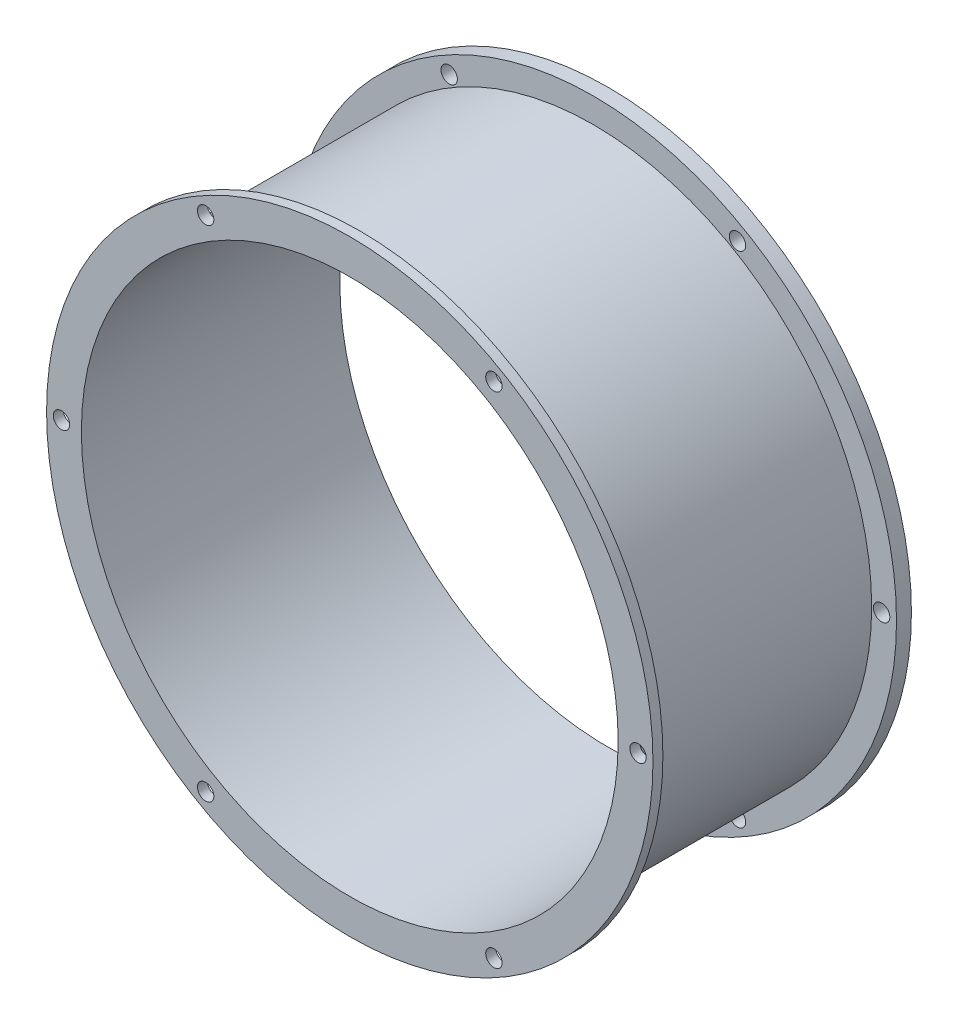
ISO-10303-21;
HEADER;
FILE_DESCRIPTION(('STEP AP214'),'2;1');
FILE_NAME('part.step','',(''),(''),'','','');
FILE_SCHEMA(('AUTOMOTIVE_DESIGN { 1 0 10303 214 1 1 1 1 }'));
ENDSEC;
DATA;
#1=APPLICATION_CONTEXT('core data for automotive mechanical design processes');
#2=APPLICATION_PROTOCOL_DEFINITION('international standard','automotive_design',2000,#1);
#3=PRODUCT_CONTEXT('',#1,'mechanical');
#4=PRODUCT('Part','Part','',(#3));
#5=PRODUCT_RELATED_PRODUCT_CATEGORY('part','',(#4));
#6=PRODUCT_DEFINITION_FORMATION('','',#4);
#7=PRODUCT_DEFINITION_CONTEXT('part definition',#1,'design');
#8=PRODUCT_DEFINITION('design','',#6,#7);
#9=PRODUCT_DEFINITION_SHAPE('','',#8);
#10=(LENGTH_UNIT() NAMED_UNIT(*) SI_UNIT(.MILLI.,.METRE.));
#11=(NAMED_UNIT(*) PLANE_ANGLE_UNIT() SI_UNIT($,.RADIAN.));
#12=(NAMED_UNIT(*) SI_UNIT($,.STERADIAN.) SOLID_ANGLE_UNIT());
#13=UNCERTAINTY_MEASURE_WITH_UNIT(LENGTH_MEASURE(1.E-05),#10,'distance_accuracy_value','');
#14=(GEOMETRIC_REPRESENTATION_CONTEXT(3) GLOBAL_UNCERTAINTY_ASSIGNED_CONTEXT((#13)) GLOBAL_UNIT_ASSIGNED_CONTEXT((#10,
#11,#12)) REPRESENTATION_CONTEXT('',''));
#15=CARTESIAN_POINT('',(0.,0.,0.));
#16=DIRECTION('',(0.,0.,1.));
#17=DIRECTION('',(1.,0.,0.));
#18=AXIS2_PLACEMENT_3D('',#15,#16,#17);
#19=CARTESIAN_POINT('',(0.,0.,20.));
#20=DIRECTION('',(0.,0.,-1.));
#21=DIRECTION('',(-1.,0.,0.));
#22=AXIS2_PLACEMENT_3D('',#19,#20,#21);
#23=CYLINDRICAL_SURFACE('',#22,56.);
#24=CARTESIAN_POINT('',(0.,0.,-29.));
#25=DIRECTION('',(0.,0.,1.));
#26=DIRECTION('',(1.,0.,0.));
#27=AXIS2_PLACEMENT_3D('',#24,#25,#26);
#28=CIRCLE('',#27,56.);
#29=CARTESIAN_POINT('',(-56.,0.,-29.));
#30=VERTEX_POINT('',#29);
#31=EDGE_CURVE('E62',#30,#30,#28,.T.);
#32=CARTESIAN_POINT('',(0.,0.,18.));
#33=DIRECTION('',(0.,0.,1.));
#34=DIRECTION('',(1.,0.,0.));
#35=AXIS2_PLACEMENT_3D('',#32,#33,#34);
#36=CIRCLE('',#35,56.);
#37=CARTESIAN_POINT('',(-56.,0.,18.));
#38=VERTEX_POINT('',#37);
#39=EDGE_CURVE('E10',#38,#38,#36,.T.);
#40=CARTESIAN_POINT('',(-56.,0.,-29.));
#41=CARTESIAN_POINT('',(-56.,0.,-28.5104166666667));
#42=CARTESIAN_POINT('',(-56.,0.,-28.0208333333333));
#43=CARTESIAN_POINT('',(-56.,0.,-27.0416666666667));
#44=CARTESIAN_POINT('',(-56.,0.,-26.5520833333333));
#45=CARTESIAN_POINT('',(-56.,0.,-25.5729166666667));
#46=CARTESIAN_POINT('',(-56.,0.,-25.0833333333333));
#47=CARTESIAN_POINT('',(-56.,0.,-24.1041666666667));
#48=CARTESIAN_POINT('',(-56.,0.,-23.6145833333333));
#49=CARTESIAN_POINT('',(-56.,0.,-22.6354166666667));
#50=CARTESIAN_POINT('',(-56.,0.,-22.1458333333333));
#51=CARTESIAN_POINT('',(-56.,0.,-21.1666666666667));
#52=CARTESIAN_POINT('',(-56.,0.,-20.6770833333333));
#53=CARTESIAN_POINT('',(-56.,0.,-19.6979166666667));
#54=CARTESIAN_POINT('',(-56.,0.,-19.2083333333333));
#55=CARTESIAN_POINT('',(-56.,0.,-18.2291666666667));
#56=CARTESIAN_POINT('',(-56.,0.,-17.7395833333333));
#57=CARTESIAN_POINT('',(-56.,0.,-16.7604166666667));
#58=CARTESIAN_POINT('',(-56.,0.,-16.2708333333333));
#59=CARTESIAN_POINT('',(-56.,0.,-15.2916666666667));
#60=CARTESIAN_POINT('',(-56.,0.,-14.8020833333333));
#61=CARTESIAN_POINT('',(-56.,0.,-13.8229166666667));
#62=CARTESIAN_POINT('',(-56.,0.,-13.3333333333333));
#63=CARTESIAN_POINT('',(-56.,0.,-12.3541666666667));
#64=CARTESIAN_POINT('',(-56.,0.,-11.8645833333333));
#65=CARTESIAN_POINT('',(-56.,0.,-10.8854166666667));
#66=CARTESIAN_POINT('',(-56.,0.,-10.3958333333333));
#67=CARTESIAN_POINT('',(-56.,0.,-9.41666666666667));
#68=CARTESIAN_POINT('',(-56.,0.,-8.92708333333334));
#69=CARTESIAN_POINT('',(-56.,0.,-7.94791666666668));
#70=CARTESIAN_POINT('',(-56.,0.,-7.45833333333334));
#71=CARTESIAN_POINT('',(-56.,0.,-6.47916666666668));
#72=CARTESIAN_POINT('',(-56.,0.,-5.98958333333334));
#73=CARTESIAN_POINT('',(-56.,0.,-5.01041666666667));
#74=CARTESIAN_POINT('',(-56.,0.,-4.52083333333334));
#75=CARTESIAN_POINT('',(-56.,0.,-3.54166666666667));
#76=CARTESIAN_POINT('',(-56.,0.,-3.05208333333334));
#77=CARTESIAN_POINT('',(-56.,0.,-2.07291666666667));
#78=CARTESIAN_POINT('',(-56.,0.,-1.58333333333334));
#79=CARTESIAN_POINT('',(-56.,0.,-0.604166666666674));
#80=CARTESIAN_POINT('',(-56.,0.,-0.11458333333334));
#81=CARTESIAN_POINT('',(-56.,0.,0.864583333333327));
#82=CARTESIAN_POINT('',(-56.,0.,1.35416666666666));
#83=CARTESIAN_POINT('',(-56.,0.,2.33333333333333));
#84=CARTESIAN_POINT('',(-56.,0.,2.82291666666666));
#85=CARTESIAN_POINT('',(-56.,0.,3.80208333333333));
#86=CARTESIAN_POINT('',(-56.,0.,4.29166666666666));
#87=CARTESIAN_POINT('',(-56.,0.,5.27083333333333));
#88=CARTESIAN_POINT('',(-56.,0.,5.76041666666666));
#89=CARTESIAN_POINT('',(-56.,0.,6.73958333333333));
#90=CARTESIAN_POINT('',(-56.,0.,7.22916666666666));
#91=CARTESIAN_POINT('',(-56.,0.,8.20833333333333));
#92=CARTESIAN_POINT('',(-56.,0.,8.69791666666666));
#93=CARTESIAN_POINT('',(-56.,0.,9.67708333333333));
#94=CARTESIAN_POINT('',(-56.,0.,10.1666666666667));
#95=CARTESIAN_POINT('',(-56.,0.,11.1458333333333));
#96=CARTESIAN_POINT('',(-56.,0.,11.6354166666667));
#97=CARTESIAN_POINT('',(-56.,0.,12.6145833333333));
#98=CARTESIAN_POINT('',(-56.,0.,13.1041666666667));
#99=CARTESIAN_POINT('',(-56.,0.,14.0833333333333));
#100=CARTESIAN_POINT('',(-56.,0.,14.5729166666667));
#101=CARTESIAN_POINT('',(-56.,0.,15.5520833333333));
#102=CARTESIAN_POINT('',(-56.,0.,16.0416666666667));
#103=CARTESIAN_POINT('',(-56.,0.,17.0208333333333));
#104=CARTESIAN_POINT('',(-56.,0.,17.5104166666667));
#105=CARTESIAN_POINT('',(-56.,0.,18.));
#106=B_SPLINE_CURVE_WITH_KNOTS('',3,(#40,#41,#42,#43,#44,#45,#46,#47,#48,#49,#50,#51,#52,#53,
#54,#55,#56,#57,#58,#59,#60,#61,#62,#63,#64,#65,#66,#67,#68,#69,#70,#71,#72,#73,#74,#75,#76,#77,
#78,#79,#80,#81,#82,#83,#84,#85,#86,#87,#88,#89,#90,#91,#92,#93,#94,#95,#96,#97,#98,#99,#100,
#101,#102,#103,#104,#105),.UNSPECIFIED.,.F.,.F.,(4,2,2,2,2,2,2,2,2,2,2,2,2,2,2,2,2,2,2,2,2,2,2,
2,2,2,2,2,2,2,2,2,4),(0.,1.46875,2.9375,4.40625,5.87500000000001,7.34375,8.8125,10.28125,11.75,
13.21875,14.6875,16.15625,17.625,19.09375,20.5625,22.03125,23.5,24.96875,26.4375,27.90625,
29.375,30.84375,32.3125,33.78125,35.25,36.71875,38.1875,39.65625,41.125,42.59375,44.0625,
45.53125,47.),.UNSPECIFIED.);
#107=EDGE_CURVE('BSEAM36',#30,#38,#106,.T.);
#108=ORIENTED_EDGE('',*,*,#31,.T.);
#109=ORIENTED_EDGE('',*,*,#39,.F.);
#110=ORIENTED_EDGE('',*,*,#107,.T.);
#111=ORIENTED_EDGE('',*,*,#107,.F.);
#112=EDGE_LOOP('',(#108,#110,#109,#111));
#113=FACE_BOUND('',#112,.T.);
#114=ADVANCED_FACE('F36',(#113),#23,.T.);
#115=CARTESIAN_POINT('',(0.,0.,20.));
#116=DIRECTION('',(0.,0.,1.));
#117=DIRECTION('',(1.,0.,0.));
#118=AXIS2_PLACEMENT_3D('',#115,#116,#117);
#119=PLANE('',#118);
#120=CARTESIAN_POINT('',(58.,0.,20.));
#121=DIRECTION('',(0.,0.,1.));
#122=DIRECTION('',(1.,0.,0.));
#123=AXIS2_PLACEMENT_3D('',#120,#121,#122);
#124=CIRCLE('',#123,1.65);
#125=CARTESIAN_POINT('',(59.65,0.,20.));
#126=VERTEX_POINT('',#125);
#127=EDGE_CURVE('E134',#126,#126,#124,.T.);
#128=ORIENTED_EDGE('',*,*,#127,.F.);
#129=EDGE_LOOP('',(#128));
#130=FACE_BOUND('',#129,.T.);
#131=CARTESIAN_POINT('',(29.,-50.2294734194974,20.));
#132=DIRECTION('',(0.,0.,1.));
#133=DIRECTION('',(1.,0.,0.));
#134=AXIS2_PLACEMENT_3D('',#131,#132,#133);
#135=CIRCLE('',#134,1.65);
#136=CARTESIAN_POINT('',(30.65,-50.2294734194974,20.));
#137=VERTEX_POINT('',#136);
#138=EDGE_CURVE('E122',#137,#137,#135,.T.);
#139=ORIENTED_EDGE('',*,*,#138,.F.);
#140=EDGE_LOOP('',(#139));
#141=FACE_BOUND('',#140,.T.);
#142=CARTESIAN_POINT('',(-29.,-50.2294734194974,20.));
#143=DIRECTION('',(0.,0.,1.));
#144=DIRECTION('',(1.,0.,0.));
#145=AXIS2_PLACEMENT_3D('',#142,#143,#144);
#146=CIRCLE('',#145,1.65);
#147=CARTESIAN_POINT('',(-27.35,-50.2294734194974,20.));
#148=VERTEX_POINT('',#147);
#149=EDGE_CURVE('E100',#148,#148,#146,.T.);
#150=ORIENTED_EDGE('',*,*,#149,.F.);
#151=EDGE_LOOP('',(#150));
#152=FACE_BOUND('',#151,.T.);
#153=CARTESIAN_POINT('',(-58.,0.,20.));
#154=DIRECTION('',(0.,0.,1.));
#155=DIRECTION('',(1.,0.,0.));
#156=AXIS2_PLACEMENT_3D('',#153,#154,#155);
#157=CIRCLE('',#156,1.65);
#158=CARTESIAN_POINT('',(-56.35,0.,20.));
#159=VERTEX_POINT('',#158);
#160=EDGE_CURVE('E95',#159,#159,#157,.T.);
#161=ORIENTED_EDGE('',*,*,#160,.F.);
#162=EDGE_LOOP('',(#161));
#163=FACE_BOUND('',#162,.T.);
#164=CARTESIAN_POINT('',(-29.,50.2294734194974,20.));
#165=DIRECTION('',(0.,0.,1.));
#166=DIRECTION('',(1.,0.,0.));
#167=AXIS2_PLACEMENT_3D('',#164,#165,#166);
#168=CIRCLE('',#167,1.65);
#169=CARTESIAN_POINT('',(-27.35,50.2294734194974,20.));
#170=VERTEX_POINT('',#169);
#171=EDGE_CURVE('E90',#170,#170,#168,.T.);
#172=ORIENTED_EDGE('',*,*,#171,.F.);
#173=EDGE_LOOP('',(#172));
#174=FACE_BOUND('',#173,.T.);
#175=CARTESIAN_POINT('',(29.,50.2294734194974,20.));
#176=DIRECTION('',(0.,0.,1.));
#177=DIRECTION('',(1.,0.,0.));
#178=AXIS2_PLACEMENT_3D('',#175,#176,#177);
#179=CIRCLE('',#178,1.65);
#180=CARTESIAN_POINT('',(30.65,50.2294734194974,20.));
#181=VERTEX_POINT('',#180);
#182=EDGE_CURVE('E84',#181,#181,#179,.T.);
#183=ORIENTED_EDGE('',*,*,#182,.F.);
#184=EDGE_LOOP('',(#183));
#185=FACE_BOUND('',#184,.T.);
#186=CARTESIAN_POINT('',(0.,0.,20.));
#187=DIRECTION('',(0.,0.,1.));
#188=DIRECTION('',(1.,0.,0.));
#189=AXIS2_PLACEMENT_3D('',#186,#187,#188);
#190=CIRCLE('',#189,54.);
#191=CARTESIAN_POINT('',(-54.,0.,20.));
#192=VERTEX_POINT('',#191);
#193=EDGE_CURVE('E44',#192,#192,#190,.T.);
#194=ORIENTED_EDGE('',*,*,#193,.F.);
#195=EDGE_LOOP('',(#194));
#196=FACE_BOUND('',#195,.T.);
#197=CARTESIAN_POINT('',(0.,0.,20.));
#198=DIRECTION('',(0.,0.,1.));
#199=DIRECTION('',(1.,0.,0.));
#200=AXIS2_PLACEMENT_3D('',#197,#198,#199);
#201=CIRCLE('',#200,61.);
#202=CARTESIAN_POINT('',(61.,0.,20.));
#203=VERTEX_POINT('',#202);
#204=EDGE_CURVE('E67',#203,#203,#201,.T.);
#205=ORIENTED_EDGE('',*,*,#204,.T.);
#206=EDGE_LOOP('',(#205));
#207=FACE_BOUND('',#206,.T.);
#208=ADVANCED_FACE('F166',(#130,#141,#152,#163,#174,#185,#196,#207),#119,.T.);
#209=CARTESIAN_POINT('',(0.,0.,-32.));
#210=DIRECTION('',(0.,0.,1.));
#211=DIRECTION('',(1.,0.,0.));
#212=AXIS2_PLACEMENT_3D('',#209,#210,#211);
#213=PLANE('',#212);
#214=CARTESIAN_POINT('',(58.,0.,-32.));
#215=DIRECTION('',(0.,0.,1.));
#216=DIRECTION('',(1.,0.,0.));
#217=AXIS2_PLACEMENT_3D('',#214,#215,#216);
#218=CIRCLE('',#217,1.65);
#219=CARTESIAN_POINT('',(59.65,0.,-32.));
#220=VERTEX_POINT('',#219);
#221=EDGE_CURVE('E130',#220,#220,#218,.T.);
#222=ORIENTED_EDGE('',*,*,#221,.T.);
#223=EDGE_LOOP('',(#222));
#224=FACE_BOUND('',#223,.T.);
#225=CARTESIAN_POINT('',(29.,-50.2294734194974,-32.));
#226=DIRECTION('',(0.,0.,1.));
#227=DIRECTION('',(1.,0.,0.));
#228=AXIS2_PLACEMENT_3D('',#225,#226,#227);
#229=CIRCLE('',#228,1.65);
#230=CARTESIAN_POINT('',(30.65,-50.2294734194974,-32.));
#231=VERTEX_POINT('',#230);
#232=EDGE_CURVE('E106',#231,#231,#229,.T.);
#233=ORIENTED_EDGE('',*,*,#232,.T.);
#234=EDGE_LOOP('',(#233));
#235=FACE_BOUND('',#234,.T.);
#236=CARTESIAN_POINT('',(-29.,-50.2294734194974,-32.));
#237=DIRECTION('',(0.,0.,1.));
#238=DIRECTION('',(1.,0.,0.));
#239=AXIS2_PLACEMENT_3D('',#236,#237,#238);
#240=CIRCLE('',#239,1.65);
#241=CARTESIAN_POINT('',(-27.35,-50.2294734194974,-32.));
#242=VERTEX_POINT('',#241);
#243=EDGE_CURVE('E109',#242,#242,#240,.T.);
#244=ORIENTED_EDGE('',*,*,#243,.T.);
#245=EDGE_LOOP('',(#244));
#246=FACE_BOUND('',#245,.T.);
#247=CARTESIAN_POINT('',(-58.,0.,-32.));
#248=DIRECTION('',(0.,0.,1.));
#249=DIRECTION('',(1.,0.,0.));
#250=AXIS2_PLACEMENT_3D('',#247,#248,#249);
#251=CIRCLE('',#250,1.65);
#252=CARTESIAN_POINT('',(-56.35,0.,-32.));
#253=VERTEX_POINT('',#252);
#254=EDGE_CURVE('E201',#253,#253,#251,.T.);
#255=ORIENTED_EDGE('',*,*,#254,.T.);
#256=EDGE_LOOP('',(#255));
#257=FACE_BOUND('',#256,.T.);
#258=CARTESIAN_POINT('',(-29.,50.2294734194974,-32.));
#259=DIRECTION('',(0.,0.,1.));
#260=DIRECTION('',(1.,0.,0.));
#261=AXIS2_PLACEMENT_3D('',#258,#259,#260);
#262=CIRCLE('',#261,1.65);
#263=CARTESIAN_POINT('',(-27.35,50.2294734194974,-32.));
#264=VERTEX_POINT('',#263);
#265=EDGE_CURVE('E205',#264,#264,#262,.T.);
#266=ORIENTED_EDGE('',*,*,#265,.T.);
#267=EDGE_LOOP('',(#266));
#268=FACE_BOUND('',#267,.T.);
#269=CARTESIAN_POINT('',(29.,50.2294734194974,-32.));
#270=DIRECTION('',(0.,0.,1.));
#271=DIRECTION('',(1.,0.,0.));
#272=AXIS2_PLACEMENT_3D('',#269,#270,#271);
#273=CIRCLE('',#272,1.65);
#274=CARTESIAN_POINT('',(30.65,50.2294734194974,-32.));
#275=VERTEX_POINT('',#274);
#276=EDGE_CURVE('E209',#275,#275,#273,.T.);
#277=ORIENTED_EDGE('',*,*,#276,.T.);
#278=EDGE_LOOP('',(#277));
#279=FACE_BOUND('',#278,.T.);
#280=CARTESIAN_POINT('',(0.,0.,-32.));
#281=DIRECTION('',(0.,0.,1.));
#282=DIRECTION('',(1.,0.,0.));
#283=AXIS2_PLACEMENT_3D('',#280,#281,#282);
#284=CIRCLE('',#283,54.);
#285=CARTESIAN_POINT('',(-54.,0.,-32.));
#286=VERTEX_POINT('',#285);
#287=EDGE_CURVE('E52',#286,#286,#284,.T.);
#288=ORIENTED_EDGE('',*,*,#287,.T.);
#289=EDGE_LOOP('',(#288));
#290=FACE_BOUND('',#289,.T.);
#291=CARTESIAN_POINT('',(0.,0.,-32.));
#292=DIRECTION('',(0.,0.,1.));
#293=DIRECTION('',(1.,0.,0.));
#294=AXIS2_PLACEMENT_3D('',#291,#292,#293);
#295=CIRCLE('',#294,61.);
#296=CARTESIAN_POINT('',(61.,0.,-32.));
#297=VERTEX_POINT('',#296);
#298=EDGE_CURVE('E63',#297,#297,#295,.T.);
#299=ORIENTED_EDGE('',*,*,#298,.F.);
#300=EDGE_LOOP('',(#299));
#301=FACE_BOUND('',#300,.T.);
#302=ADVANCED_FACE('F171',(#224,#235,#246,#257,#268,#279,#290,#301),#213,.F.);
#303=CARTESIAN_POINT('',(0.,0.,20.));
#304=DIRECTION('',(0.,0.,-1.));
#305=DIRECTION('',(-1.,0.,0.));
#306=AXIS2_PLACEMENT_3D('',#303,#304,#305);
#307=CYLINDRICAL_SURFACE('',#306,54.);
#308=CARTESIAN_POINT('',(-54.,0.,20.));
#309=CARTESIAN_POINT('',(-54.,0.,19.4583333333333));
#310=CARTESIAN_POINT('',(-54.,0.,18.9166666666667));
#311=CARTESIAN_POINT('',(-54.,0.,17.8333333333333));
#312=CARTESIAN_POINT('',(-54.,0.,17.2916666666667));
#313=CARTESIAN_POINT('',(-54.,0.,16.2083333333333));
#314=CARTESIAN_POINT('',(-54.,0.,15.6666666666667));
#315=CARTESIAN_POINT('',(-54.,0.,14.5833333333333));
#316=CARTESIAN_POINT('',(-54.,0.,14.0416666666667));
#317=CARTESIAN_POINT('',(-54.,0.,12.9583333333333));
#318=CARTESIAN_POINT('',(-54.,0.,12.4166666666667));
#319=CARTESIAN_POINT('',(-54.,0.,11.3333333333333));
#320=CARTESIAN_POINT('',(-54.,0.,10.7916666666667));
#321=CARTESIAN_POINT('',(-54.,0.,9.70833333333333));
#322=CARTESIAN_POINT('',(-54.,0.,9.16666666666666));
#323=CARTESIAN_POINT('',(-54.,0.,8.08333333333333));
#324=CARTESIAN_POINT('',(-54.,0.,7.54166666666666));
#325=CARTESIAN_POINT('',(-54.,0.,6.45833333333333));
#326=CARTESIAN_POINT('',(-54.,0.,5.91666666666666));
#327=CARTESIAN_POINT('',(-54.,0.,4.83333333333333));
#328=CARTESIAN_POINT('',(-54.,0.,4.29166666666667));
#329=CARTESIAN_POINT('',(-54.,0.,3.20833333333333));
#330=CARTESIAN_POINT('',(-54.,0.,2.66666666666667));
#331=CARTESIAN_POINT('',(-54.,0.,1.58333333333333));
#332=CARTESIAN_POINT('',(-54.,0.,1.04166666666666));
#333=CARTESIAN_POINT('',(-54.,0.,-0.0416666666666691));
#334=CARTESIAN_POINT('',(-54.,0.,-0.583333333333335));
#335=CARTESIAN_POINT('',(-54.,0.,-1.66666666666667));
#336=CARTESIAN_POINT('',(-54.,0.,-2.20833333333334));
#337=CARTESIAN_POINT('',(-54.,0.,-3.29166666666667));
#338=CARTESIAN_POINT('',(-54.,0.,-3.83333333333333));
#339=CARTESIAN_POINT('',(-54.,0.,-4.91666666666667));
#340=CARTESIAN_POINT('',(-54.,0.,-5.45833333333333));
#341=CARTESIAN_POINT('',(-54.,0.,-6.54166666666667));
#342=CARTESIAN_POINT('',(-54.,0.,-7.08333333333334));
#343=CARTESIAN_POINT('',(-54.,0.,-8.16666666666667));
#344=CARTESIAN_POINT('',(-54.,0.,-8.70833333333334));
#345=CARTESIAN_POINT('',(-54.,0.,-9.79166666666667));
#346=CARTESIAN_POINT('',(-54.,0.,-10.3333333333333));
#347=CARTESIAN_POINT('',(-54.,0.,-11.4166666666667));
#348=CARTESIAN_POINT('',(-54.,0.,-11.9583333333333));
#349=CARTESIAN_POINT('',(-54.,0.,-13.0416666666667));
#350=CARTESIAN_POINT('',(-54.,0.,-13.5833333333333));
#351=CARTESIAN_POINT('',(-54.,0.,-14.6666666666667));
#352=CARTESIAN_POINT('',(-54.,0.,-15.2083333333333));
#353=CARTESIAN_POINT('',(-54.,0.,-16.2916666666667));
#354=CARTESIAN_POINT('',(-54.,0.,-16.8333333333333));
#355=CARTESIAN_POINT('',(-54.,0.,-17.9166666666667));
#356=CARTESIAN_POINT('',(-54.,0.,-18.4583333333333));
#357=CARTESIAN_POINT('',(-54.,0.,-19.5416666666667));
#358=CARTESIAN_POINT('',(-54.,0.,-20.0833333333333));
#359=CARTESIAN_POINT('',(-54.,0.,-21.1666666666667));
#360=CARTESIAN_POINT('',(-54.,0.,-21.7083333333333));
#361=CARTESIAN_POINT('',(-54.,0.,-22.7916666666667));
#362=CARTESIAN_POINT('',(-54.,0.,-23.3333333333333));
#363=CARTESIAN_POINT('',(-54.,0.,-24.4166666666667));
#364=CARTESIAN_POINT('',(-54.,0.,-24.9583333333333));
#365=CARTESIAN_POINT('',(-54.,0.,-26.0416666666667));
#366=CARTESIAN_POINT('',(-54.,0.,-26.5833333333333));
#367=CARTESIAN_POINT('',(-54.,0.,-27.6666666666667));
#368=CARTESIAN_POINT('',(-54.,0.,-28.2083333333333));
#369=CARTESIAN_POINT('',(-54.,0.,-29.2916666666667));
#370=CARTESIAN_POINT('',(-54.,0.,-29.8333333333333));
#371=CARTESIAN_POINT('',(-54.,0.,-30.9166666666667));
#372=CARTESIAN_POINT('',(-54.,0.,-31.4583333333333));
#373=CARTESIAN_POINT('',(-54.,0.,-32.));
#374=B_SPLINE_CURVE_WITH_KNOTS('',3,(#308,#309,#310,#311,#312,#313,#314,#315,#316,#317,#318,
#319,#320,#321,#322,#323,#324,#325,#326,#327,#328,#329,#330,#331,#332,#333,#334,#335,#336,#337,
#338,#339,#340,#341,#342,#343,#344,#345,#346,#347,#348,#349,#350,#351,#352,#353,#354,#355,#356,
#357,#358,#359,#360,#361,#362,#363,#364,#365,#366,#367,#368,#369,#370,#371,#372,#373),
.UNSPECIFIED.,.F.,.F.,(4,2,2,2,2,2,2,2,2,2,2,2,2,2,2,2,2,2,2,2,2,2,2,2,2,2,2,2,2,2,2,2,4),(0.,
1.625,3.25,4.875,6.5,8.125,9.75,11.375,13.,14.625,16.25,17.875,19.5,21.125,22.75,24.375,26.,
27.625,29.25,30.875,32.5,34.125,35.75,37.375,39.,40.625,42.25,43.875,45.5,47.125,48.75,50.375,
52.),.UNSPECIFIED.);
#375=EDGE_CURVE('BSEAM178',#192,#286,#374,.T.);
#376=ORIENTED_EDGE('',*,*,#193,.T.);
#377=ORIENTED_EDGE('',*,*,#287,.F.);
#378=ORIENTED_EDGE('',*,*,#375,.T.);
#379=ORIENTED_EDGE('',*,*,#375,.F.);
#380=EDGE_LOOP('',(#376,#378,#377,#379));
#381=FACE_BOUND('',#380,.T.);
#382=ADVANCED_FACE('F178',(#381),#307,.F.);
#383=CARTESIAN_POINT('',(0.,0.,-29.));
#384=DIRECTION('',(0.,0.,1.));
#385=DIRECTION('',(1.,0.,0.));
#386=AXIS2_PLACEMENT_3D('',#383,#384,#385);
#387=PLANE('',#386);
#388=CARTESIAN_POINT('',(58.,0.,-29.));
#389=DIRECTION('',(0.,0.,1.));
#390=DIRECTION('',(1.,0.,0.));
#391=AXIS2_PLACEMENT_3D('',#388,#389,#390);
#392=CIRCLE('',#391,1.65);
#393=CARTESIAN_POINT('',(59.65,0.,-29.));
#394=VERTEX_POINT('',#393);
#395=EDGE_CURVE('E126',#394,#394,#392,.T.);
#396=ORIENTED_EDGE('',*,*,#395,.F.);
#397=EDGE_LOOP('',(#396));
#398=FACE_BOUND('',#397,.T.);
#399=CARTESIAN_POINT('',(29.,-50.2294734194974,-29.));
#400=DIRECTION('',(0.,0.,1.));
#401=DIRECTION('',(1.,0.,0.));
#402=AXIS2_PLACEMENT_3D('',#399,#400,#401);
#403=CIRCLE('',#402,1.65);
#404=CARTESIAN_POINT('',(30.65,-50.2294734194974,-29.));
#405=VERTEX_POINT('',#404);
#406=EDGE_CURVE('E99',#405,#405,#403,.T.);
#407=ORIENTED_EDGE('',*,*,#406,.F.);
#408=EDGE_LOOP('',(#407));
#409=FACE_BOUND('',#408,.T.);
#410=CARTESIAN_POINT('',(-29.,-50.2294734194974,-29.));
#411=DIRECTION('',(0.,0.,1.));
#412=DIRECTION('',(1.,0.,0.));
#413=AXIS2_PLACEMENT_3D('',#410,#411,#412);
#414=CIRCLE('',#413,1.65);
#415=CARTESIAN_POINT('',(-27.35,-50.2294734194974,-29.));
#416=VERTEX_POINT('',#415);
#417=EDGE_CURVE('E94',#416,#416,#414,.T.);
#418=ORIENTED_EDGE('',*,*,#417,.F.);
#419=EDGE_LOOP('',(#418));
#420=FACE_BOUND('',#419,.T.);
#421=CARTESIAN_POINT('',(-58.,0.,-29.));
#422=DIRECTION('',(0.,0.,1.));
#423=DIRECTION('',(1.,0.,0.));
#424=AXIS2_PLACEMENT_3D('',#421,#422,#423);
#425=CIRCLE('',#424,1.65);
#426=CARTESIAN_POINT('',(-56.35,0.,-29.));
#427=VERTEX_POINT('',#426);
#428=EDGE_CURVE('E89',#427,#427,#425,.T.);
#429=ORIENTED_EDGE('',*,*,#428,.F.);
#430=EDGE_LOOP('',(#429));
#431=FACE_BOUND('',#430,.T.);
#432=CARTESIAN_POINT('',(-29.,50.2294734194974,-29.));
#433=DIRECTION('',(0.,0.,1.));
#434=DIRECTION('',(1.,0.,0.));
#435=AXIS2_PLACEMENT_3D('',#432,#433,#434);
#436=CIRCLE('',#435,1.65);
#437=CARTESIAN_POINT('',(-27.35,50.2294734194974,-29.));
#438=VERTEX_POINT('',#437);
#439=EDGE_CURVE('E83',#438,#438,#436,.T.);
#440=ORIENTED_EDGE('',*,*,#439,.F.);
#441=EDGE_LOOP('',(#440));
#442=FACE_BOUND('',#441,.T.);
#443=CARTESIAN_POINT('',(29.,50.2294734194974,-29.));
#444=DIRECTION('',(0.,0.,1.));
#445=DIRECTION('',(1.,0.,0.));
#446=AXIS2_PLACEMENT_3D('',#443,#444,#445);
#447=CIRCLE('',#446,1.65);
#448=CARTESIAN_POINT('',(30.65,50.2294734194974,-29.));
#449=VERTEX_POINT('',#448);
#450=EDGE_CURVE('E78',#449,#449,#447,.T.);
#451=ORIENTED_EDGE('',*,*,#450,.F.);
#452=EDGE_LOOP('',(#451));
#453=FACE_BOUND('',#452,.T.);
#454=CARTESIAN_POINT('',(0.,0.,-29.));
#455=DIRECTION('',(0.,0.,1.));
#456=DIRECTION('',(1.,0.,0.));
#457=AXIS2_PLACEMENT_3D('',#454,#455,#456);
#458=CIRCLE('',#457,61.);
#459=CARTESIAN_POINT('',(61.,0.,-29.));
#460=VERTEX_POINT('',#459);
#461=EDGE_CURVE('E58',#460,#460,#458,.T.);
#462=ORIENTED_EDGE('',*,*,#461,.T.);
#463=EDGE_LOOP('',(#462));
#464=FACE_BOUND('',#463,.T.);
#465=ORIENTED_EDGE('',*,*,#31,.F.);
#466=EDGE_LOOP('',(#465));
#467=FACE_BOUND('',#466,.T.);
#468=ADVANCED_FACE('F160',(#398,#409,#420,#431,#442,#453,#464,#467),#387,.T.);
#469=CARTESIAN_POINT('',(0.,0.,-29.));
#470=DIRECTION('',(0.,0.,-1.));
#471=DIRECTION('',(-1.,0.,0.));
#472=AXIS2_PLACEMENT_3D('',#469,#470,#471);
#473=CYLINDRICAL_SURFACE('',#472,61.);
#474=ORIENTED_EDGE('',*,*,#461,.F.);
#475=EDGE_LOOP('',(#474));
#476=FACE_BOUND('',#475,.T.);
#477=ORIENTED_EDGE('',*,*,#298,.T.);
#478=EDGE_LOOP('',(#477));
#479=FACE_BOUND('',#478,.T.);
#480=ADVANCED_FACE('F150',(#476,#479),#473,.T.);
#481=CARTESIAN_POINT('',(0.,0.,18.));
#482=DIRECTION('',(0.,0.,1.));
#483=DIRECTION('',(1.,0.,0.));
#484=AXIS2_PLACEMENT_3D('',#481,#482,#483);
#485=PLANE('',#484);
#486=CARTESIAN_POINT('',(58.,0.,18.));
#487=DIRECTION('',(0.,0.,1.));
#488=DIRECTION('',(1.,0.,0.));
#489=AXIS2_PLACEMENT_3D('',#486,#487,#488);
#490=CIRCLE('',#489,1.65);
#491=CARTESIAN_POINT('',(59.65,0.,18.));
#492=VERTEX_POINT('',#491);
#493=EDGE_CURVE('E39',#492,#492,#490,.T.);
#494=ORIENTED_EDGE('',*,*,#493,.T.);
#495=EDGE_LOOP('',(#494));
#496=FACE_BOUND('',#495,.T.);
#497=CARTESIAN_POINT('',(29.,-50.2294734194974,18.));
#498=DIRECTION('',(0.,0.,1.));
#499=DIRECTION('',(1.,0.,0.));
#500=AXIS2_PLACEMENT_3D('',#497,#498,#499);
#501=CIRCLE('',#500,1.65);
#502=CARTESIAN_POINT('',(30.65,-50.2294734194974,18.));
#503=VERTEX_POINT('',#502);
#504=EDGE_CURVE('E96',#503,#503,#501,.T.);
#505=ORIENTED_EDGE('',*,*,#504,.T.);
#506=EDGE_LOOP('',(#505));
#507=FACE_BOUND('',#506,.T.);
#508=CARTESIAN_POINT('',(-29.,-50.2294734194974,18.));
#509=DIRECTION('',(0.,0.,1.));
#510=DIRECTION('',(1.,0.,0.));
#511=AXIS2_PLACEMENT_3D('',#508,#509,#510);
#512=CIRCLE('',#511,1.65);
#513=CARTESIAN_POINT('',(-27.35,-50.2294734194974,18.));
#514=VERTEX_POINT('',#513);
#515=EDGE_CURVE('E91',#514,#514,#512,.T.);
#516=ORIENTED_EDGE('',*,*,#515,.T.);
#517=EDGE_LOOP('',(#516));
#518=FACE_BOUND('',#517,.T.);
#519=CARTESIAN_POINT('',(-58.,0.,18.));
#520=DIRECTION('',(0.,0.,1.));
#521=DIRECTION('',(1.,0.,0.));
#522=AXIS2_PLACEMENT_3D('',#519,#520,#521);
#523=CIRCLE('',#522,1.65);
#524=CARTESIAN_POINT('',(-56.35,0.,18.));
#525=VERTEX_POINT('',#524);
#526=EDGE_CURVE('E85',#525,#525,#523,.T.);
#527=ORIENTED_EDGE('',*,*,#526,.T.);
#528=EDGE_LOOP('',(#527));
#529=FACE_BOUND('',#528,.T.);
#530=CARTESIAN_POINT('',(-29.,50.2294734194974,18.));
#531=DIRECTION('',(0.,0.,1.));
#532=DIRECTION('',(1.,0.,0.));
#533=AXIS2_PLACEMENT_3D('',#530,#531,#532);
#534=CIRCLE('',#533,1.65);
#535=CARTESIAN_POINT('',(-27.35,50.2294734194974,18.));
#536=VERTEX_POINT('',#535);
#537=EDGE_CURVE('E79',#536,#536,#534,.T.);
#538=ORIENTED_EDGE('',*,*,#537,.T.);
#539=EDGE_LOOP('',(#538));
#540=FACE_BOUND('',#539,.T.);
#541=CARTESIAN_POINT('',(29.,50.2294734194974,18.));
#542=DIRECTION('',(0.,0.,1.));
#543=DIRECTION('',(1.,0.,0.));
#544=AXIS2_PLACEMENT_3D('',#541,#542,#543);
#545=CIRCLE('',#544,1.65);
#546=CARTESIAN_POINT('',(30.65,50.2294734194974,18.));
#547=VERTEX_POINT('',#546);
#548=EDGE_CURVE('E74',#547,#547,#545,.T.);
#549=ORIENTED_EDGE('',*,*,#548,.T.);
#550=EDGE_LOOP('',(#549));
#551=FACE_BOUND('',#550,.T.);
#552=CARTESIAN_POINT('',(0.,0.,18.));
#553=DIRECTION('',(0.,0.,1.));
#554=DIRECTION('',(1.,0.,0.));
#555=AXIS2_PLACEMENT_3D('',#552,#553,#554);
#556=CIRCLE('',#555,61.);
#557=CARTESIAN_POINT('',(61.,0.,18.));
#558=VERTEX_POINT('',#557);
#559=EDGE_CURVE('E56',#558,#558,#556,.T.);
#560=ORIENTED_EDGE('',*,*,#559,.F.);
#561=EDGE_LOOP('',(#560));
#562=FACE_BOUND('',#561,.T.);
#563=ORIENTED_EDGE('',*,*,#39,.T.);
#564=EDGE_LOOP('',(#563));
#565=FACE_BOUND('',#564,.T.);
#566=ADVANCED_FACE('F148',(#496,#507,#518,#529,#540,#551,#562,#565),#485,.F.);
#567=CARTESIAN_POINT('',(0.,0.,20.));
#568=DIRECTION('',(0.,0.,-1.));
#569=DIRECTION('',(-1.,0.,0.));
#570=AXIS2_PLACEMENT_3D('',#567,#568,#569);
#571=CYLINDRICAL_SURFACE('',#570,61.);
#572=ORIENTED_EDGE('',*,*,#204,.F.);
#573=EDGE_LOOP('',(#572));
#574=FACE_BOUND('',#573,.T.);
#575=ORIENTED_EDGE('',*,*,#559,.T.);
#576=EDGE_LOOP('',(#575));
#577=FACE_BOUND('',#576,.T.);
#578=ADVANCED_FACE('F146',(#574,#577),#571,.T.);
#579=CARTESIAN_POINT('',(29.,50.2294734194974,-100.));
#580=DIRECTION('',(0.,0.,1.));
#581=DIRECTION('',(1.,0.,0.));
#582=AXIS2_PLACEMENT_3D('',#579,#580,#581);
#583=CYLINDRICAL_SURFACE('',#582,1.65);
#584=ORIENTED_EDGE('',*,*,#182,.T.);
#585=EDGE_LOOP('',(#584));
#586=FACE_BOUND('',#585,.T.);
#587=ORIENTED_EDGE('',*,*,#548,.F.);
#588=EDGE_LOOP('',(#587));
#589=FACE_BOUND('',#588,.T.);
#590=ADVANCED_FACE('F157',(#586,#589),#583,.F.);
#591=CARTESIAN_POINT('',(-29.,50.2294734194974,-100.));
#592=DIRECTION('',(0.,0.,1.));
#593=DIRECTION('',(1.,0.,0.));
#594=AXIS2_PLACEMENT_3D('',#591,#592,#593);
#595=CYLINDRICAL_SURFACE('',#594,1.65);
#596=ORIENTED_EDGE('',*,*,#171,.T.);
#597=EDGE_LOOP('',(#596));
#598=FACE_BOUND('',#597,.T.);
#599=ORIENTED_EDGE('',*,*,#537,.F.);
#600=EDGE_LOOP('',(#599));
#601=FACE_BOUND('',#600,.T.);
#602=ADVANCED_FACE('F265',(#598,#601),#595,.F.);
#603=CARTESIAN_POINT('',(-58.,0.,-100.));
#604=DIRECTION('',(0.,0.,1.));
#605=DIRECTION('',(1.,0.,0.));
#606=AXIS2_PLACEMENT_3D('',#603,#604,#605);
#607=CYLINDRICAL_SURFACE('',#606,1.65);
#608=ORIENTED_EDGE('',*,*,#160,.T.);
#609=EDGE_LOOP('',(#608));
#610=FACE_BOUND('',#609,.T.);
#611=ORIENTED_EDGE('',*,*,#526,.F.);
#612=EDGE_LOOP('',(#611));
#613=FACE_BOUND('',#612,.T.);
#614=ADVANCED_FACE('F276',(#610,#613),#607,.F.);
#615=CARTESIAN_POINT('',(-29.,-50.2294734194974,-100.));
#616=DIRECTION('',(0.,0.,1.));
#617=DIRECTION('',(1.,0.,0.));
#618=AXIS2_PLACEMENT_3D('',#615,#616,#617);
#619=CYLINDRICAL_SURFACE('',#618,1.65);
#620=ORIENTED_EDGE('',*,*,#149,.T.);
#621=EDGE_LOOP('',(#620));
#622=FACE_BOUND('',#621,.T.);
#623=ORIENTED_EDGE('',*,*,#515,.F.);
#624=EDGE_LOOP('',(#623));
#625=FACE_BOUND('',#624,.T.);
#626=ADVANCED_FACE('F288',(#622,#625),#619,.F.);
#627=CARTESIAN_POINT('',(29.,-50.2294734194974,-100.));
#628=DIRECTION('',(0.,0.,1.));
#629=DIRECTION('',(1.,0.,0.));
#630=AXIS2_PLACEMENT_3D('',#627,#628,#629);
#631=CYLINDRICAL_SURFACE('',#630,1.65);
#632=ORIENTED_EDGE('',*,*,#138,.T.);
#633=EDGE_LOOP('',(#632));
#634=FACE_BOUND('',#633,.T.);
#635=ORIENTED_EDGE('',*,*,#504,.F.);
#636=EDGE_LOOP('',(#635));
#637=FACE_BOUND('',#636,.T.);
#638=ADVANCED_FACE('F266',(#634,#637),#631,.F.);
#639=CARTESIAN_POINT('',(58.,0.,-100.));
#640=DIRECTION('',(0.,0.,1.));
#641=DIRECTION('',(1.,0.,0.));
#642=AXIS2_PLACEMENT_3D('',#639,#640,#641);
#643=CYLINDRICAL_SURFACE('',#642,1.65);
#644=ORIENTED_EDGE('',*,*,#127,.T.);
#645=EDGE_LOOP('',(#644));
#646=FACE_BOUND('',#645,.T.);
#647=ORIENTED_EDGE('',*,*,#493,.F.);
#648=EDGE_LOOP('',(#647));
#649=FACE_BOUND('',#648,.T.);
#650=ADVANCED_FACE('F256',(#646,#649),#643,.F.);
#651=ORIENTED_EDGE('',*,*,#450,.T.);
#652=EDGE_LOOP('',(#651));
#653=FACE_BOUND('',#652,.T.);
#654=ORIENTED_EDGE('',*,*,#276,.F.);
#655=EDGE_LOOP('',(#654));
#656=FACE_BOUND('',#655,.T.);
#657=ADVANCED_FACE('F253',(#653,#656),#583,.F.);
#658=ORIENTED_EDGE('',*,*,#439,.T.);
#659=EDGE_LOOP('',(#658));
#660=FACE_BOUND('',#659,.T.);
#661=ORIENTED_EDGE('',*,*,#265,.F.);
#662=EDGE_LOOP('',(#661));
#663=FACE_BOUND('',#662,.T.);
#664=ADVANCED_FACE('F255',(#660,#663),#595,.F.);
#665=ORIENTED_EDGE('',*,*,#428,.T.);
#666=EDGE_LOOP('',(#665));
#667=FACE_BOUND('',#666,.T.);
#668=ORIENTED_EDGE('',*,*,#254,.F.);
#669=EDGE_LOOP('',(#668));
#670=FACE_BOUND('',#669,.T.);
#671=ADVANCED_FACE('F262',(#667,#670),#607,.F.);
#672=ORIENTED_EDGE('',*,*,#417,.T.);
#673=EDGE_LOOP('',(#672));
#674=FACE_BOUND('',#673,.T.);
#675=ORIENTED_EDGE('',*,*,#243,.F.);
#676=EDGE_LOOP('',(#675));
#677=FACE_BOUND('',#676,.T.);
#678=ADVANCED_FACE('F241',(#674,#677),#619,.F.);
#679=ORIENTED_EDGE('',*,*,#406,.T.);
#680=EDGE_LOOP('',(#679));
#681=FACE_BOUND('',#680,.T.);
#682=ORIENTED_EDGE('',*,*,#232,.F.);
#683=EDGE_LOOP('',(#682));
#684=FACE_BOUND('',#683,.T.);
#685=ADVANCED_FACE('F295',(#681,#684),#631,.F.);
#686=ORIENTED_EDGE('',*,*,#395,.T.);
#687=EDGE_LOOP('',(#686));
#688=FACE_BOUND('',#687,.T.);
#689=ORIENTED_EDGE('',*,*,#221,.F.);
#690=EDGE_LOOP('',(#689));
#691=FACE_BOUND('',#690,.T.);
#692=ADVANCED_FACE('F269',(#688,#691),#643,.F.);
#693=CLOSED_SHELL('',(#114,#208,#302,#382,#468,#480,#566,#578,#590,#602,#614,#626,#638,#650,
#657,#664,#671,#678,#685,#692));
#694=MANIFOLD_SOLID_BREP('B2',#693);
#695=ADVANCED_BREP_SHAPE_REPRESENTATION('',(#18,#694),#14);
#696=SHAPE_DEFINITION_REPRESENTATION(#9,#695);
ENDSEC;
END-ISO-10303-21;
